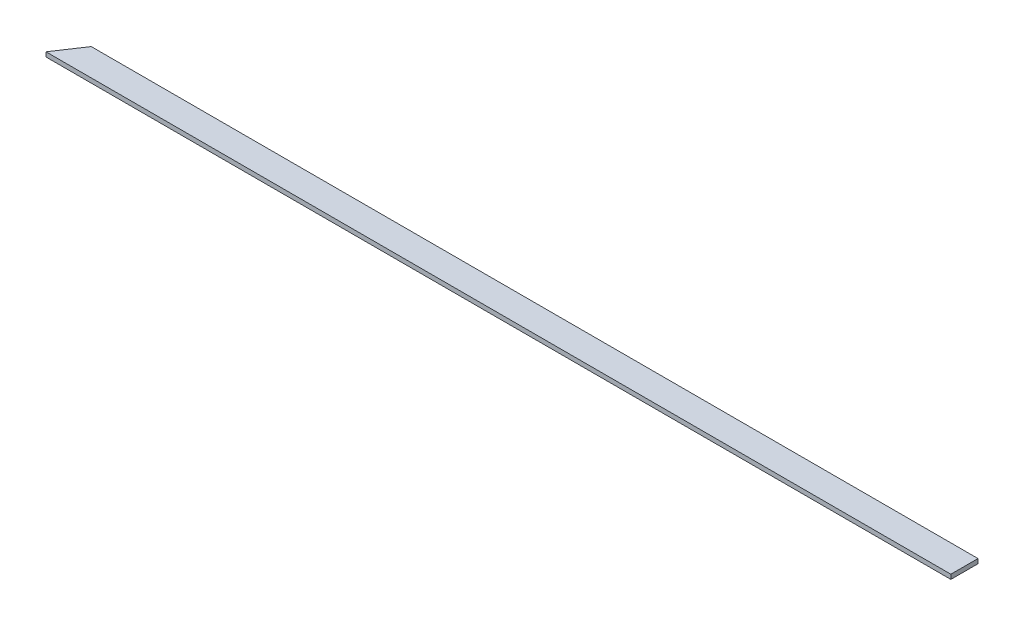
ISO-10303-21;
HEADER;
FILE_DESCRIPTION(('STEP AP214'),'2;1');
FILE_NAME('part.step','',(''),(''),'','','');
FILE_SCHEMA(('AUTOMOTIVE_DESIGN { 1 0 10303 214 1 1 1 1 }'));
ENDSEC;
DATA;
#1=APPLICATION_CONTEXT('core data for automotive mechanical design processes');
#2=APPLICATION_PROTOCOL_DEFINITION('international standard','automotive_design',2000,#1);
#3=PRODUCT_CONTEXT('',#1,'mechanical');
#4=PRODUCT('Part','Part','',(#3));
#5=PRODUCT_RELATED_PRODUCT_CATEGORY('part','',(#4));
#6=PRODUCT_DEFINITION_FORMATION('','',#4);
#7=PRODUCT_DEFINITION_CONTEXT('part definition',#1,'design');
#8=PRODUCT_DEFINITION('design','',#6,#7);
#9=PRODUCT_DEFINITION_SHAPE('','',#8);
#10=(LENGTH_UNIT() NAMED_UNIT(*) SI_UNIT(.MILLI.,.METRE.));
#11=(NAMED_UNIT(*) PLANE_ANGLE_UNIT() SI_UNIT($,.RADIAN.));
#12=(NAMED_UNIT(*) SI_UNIT($,.STERADIAN.) SOLID_ANGLE_UNIT());
#13=UNCERTAINTY_MEASURE_WITH_UNIT(LENGTH_MEASURE(1.E-05),#10,'distance_accuracy_value','');
#14=(GEOMETRIC_REPRESENTATION_CONTEXT(3) GLOBAL_UNCERTAINTY_ASSIGNED_CONTEXT((#13)) GLOBAL_UNIT_ASSIGNED_CONTEXT((#10,
#11,#12)) REPRESENTATION_CONTEXT('',''));
#15=CARTESIAN_POINT('',(0.,0.,0.));
#16=DIRECTION('',(0.,0.,1.));
#17=DIRECTION('',(1.,0.,0.));
#18=AXIS2_PLACEMENT_3D('',#15,#16,#17);
#19=CARTESIAN_POINT('',(-25.,0.125,0.));
#20=DIRECTION('',(0.832050294337845,0.,0.554700196225227));
#21=DIRECTION('',(0.554700196225227,0.,-0.832050294337845));
#22=AXIS2_PLACEMENT_3D('',#19,#20,#21);
#23=PLANE('',#22);
#24=DIRECTION('',(-0.554700196225227,0.,0.832050294337845));
#25=VECTOR('',#24,1.);
#26=CARTESIAN_POINT('',(-25.,-0.125,0.));
#27=LINE('',#26,#25);
#28=CARTESIAN_POINT('',(-24.,-0.125,-1.50000000000001));
#29=VERTEX_POINT('',#28);
#30=CARTESIAN_POINT('',(-25.,-0.125,0.));
#31=VERTEX_POINT('',#30);
#32=EDGE_CURVE('E107',#29,#31,#27,.T.);
#33=ORIENTED_EDGE('',*,*,#32,.T.);
#34=DIRECTION('',(0.,-1.,0.));
#35=VECTOR('',#34,1.);
#36=CARTESIAN_POINT('',(-25.,0.125,0.));
#37=LINE('',#36,#35);
#38=CARTESIAN_POINT('',(-25.,0.125,0.));
#39=VERTEX_POINT('',#38);
#40=EDGE_CURVE('E11',#39,#31,#37,.T.);
#41=ORIENTED_EDGE('',*,*,#40,.F.);
#42=DIRECTION('',(-0.554700196225227,0.,0.832050294337845));
#43=VECTOR('',#42,1.);
#44=CARTESIAN_POINT('',(-25.,0.125,0.));
#45=LINE('',#44,#43);
#46=CARTESIAN_POINT('',(-24.,0.125,-1.50000000000001));
#47=VERTEX_POINT('',#46);
#48=EDGE_CURVE('E91',#47,#39,#45,.T.);
#49=ORIENTED_EDGE('',*,*,#48,.F.);
#50=DIRECTION('',(0.,-1.,0.));
#51=VECTOR('',#50,1.);
#52=CARTESIAN_POINT('',(-24.,0.125,-1.50000000000001));
#53=LINE('',#52,#51);
#54=EDGE_CURVE('E103',#47,#29,#53,.T.);
#55=ORIENTED_EDGE('',*,*,#54,.T.);
#56=EDGE_LOOP('',(#33,#41,#49,#55));
#57=FACE_BOUND('',#56,.T.);
#58=ADVANCED_FACE('F39',(#57),#23,.F.);
#59=CARTESIAN_POINT('',(-25.,0.125,0.));
#60=DIRECTION('',(0.,0.,-1.));
#61=DIRECTION('',(-1.,0.,0.));
#62=AXIS2_PLACEMENT_3D('',#59,#60,#61);
#63=PLANE('',#62);
#64=DIRECTION('',(1.,0.,0.));
#65=VECTOR('',#64,1.);
#66=CARTESIAN_POINT('',(-25.,-0.125,0.));
#67=LINE('',#66,#65);
#68=CARTESIAN_POINT('',(25.,-0.125,0.));
#69=VERTEX_POINT('',#68);
#70=EDGE_CURVE('E96',#31,#69,#67,.T.);
#71=ORIENTED_EDGE('',*,*,#70,.T.);
#72=DIRECTION('',(0.,-1.,0.));
#73=VECTOR('',#72,1.);
#74=CARTESIAN_POINT('',(25.,0.125,0.));
#75=LINE('',#74,#73);
#76=CARTESIAN_POINT('',(25.,0.125,0.));
#77=VERTEX_POINT('',#76);
#78=EDGE_CURVE('E48',#77,#69,#75,.T.);
#79=ORIENTED_EDGE('',*,*,#78,.F.);
#80=DIRECTION('',(1.,0.,0.));
#81=VECTOR('',#80,1.);
#82=CARTESIAN_POINT('',(-25.,0.125,0.));
#83=LINE('',#82,#81);
#84=EDGE_CURVE('E86',#39,#77,#83,.T.);
#85=ORIENTED_EDGE('',*,*,#84,.F.);
#86=ORIENTED_EDGE('',*,*,#40,.T.);
#87=EDGE_LOOP('',(#71,#79,#85,#86));
#88=FACE_BOUND('',#87,.T.);
#89=ADVANCED_FACE('F95',(#88),#63,.F.);
#90=CARTESIAN_POINT('',(25.,0.125,-1.50000000000001));
#91=DIRECTION('',(-1.,0.,0.));
#92=DIRECTION('',(0.,0.,1.));
#93=AXIS2_PLACEMENT_3D('',#90,#91,#92);
#94=PLANE('',#93);
#95=DIRECTION('',(0.,0.,-1.));
#96=VECTOR('',#95,1.);
#97=CARTESIAN_POINT('',(25.,-0.125,-1.50000000000001));
#98=LINE('',#97,#96);
#99=CARTESIAN_POINT('',(25.,-0.125,-1.50000000000001));
#100=VERTEX_POINT('',#99);
#101=EDGE_CURVE('E73',#69,#100,#98,.T.);
#102=ORIENTED_EDGE('',*,*,#101,.T.);
#103=DIRECTION('',(0.,-1.,0.));
#104=VECTOR('',#103,1.);
#105=CARTESIAN_POINT('',(25.,0.125,-1.50000000000001));
#106=LINE('',#105,#104);
#107=CARTESIAN_POINT('',(25.,0.125,-1.50000000000001));
#108=VERTEX_POINT('',#107);
#109=EDGE_CURVE('E98',#108,#100,#106,.T.);
#110=ORIENTED_EDGE('',*,*,#109,.F.);
#111=DIRECTION('',(0.,0.,-1.));
#112=VECTOR('',#111,1.);
#113=CARTESIAN_POINT('',(25.,0.125,-1.50000000000001));
#114=LINE('',#113,#112);
#115=EDGE_CURVE('E89',#77,#108,#114,.T.);
#116=ORIENTED_EDGE('',*,*,#115,.F.);
#117=ORIENTED_EDGE('',*,*,#78,.T.);
#118=EDGE_LOOP('',(#102,#110,#116,#117));
#119=FACE_BOUND('',#118,.T.);
#120=ADVANCED_FACE('F99',(#119),#94,.F.);
#121=CARTESIAN_POINT('',(-24.,0.125,-1.50000000000001));
#122=DIRECTION('',(0.,0.,1.));
#123=DIRECTION('',(1.,0.,0.));
#124=AXIS2_PLACEMENT_3D('',#121,#122,#123);
#125=PLANE('',#124);
#126=DIRECTION('',(-1.,0.,0.));
#127=VECTOR('',#126,1.);
#128=CARTESIAN_POINT('',(-24.,-0.125,-1.50000000000001));
#129=LINE('',#128,#127);
#130=EDGE_CURVE('E79',#100,#29,#129,.T.);
#131=ORIENTED_EDGE('',*,*,#130,.T.);
#132=ORIENTED_EDGE('',*,*,#54,.F.);
#133=DIRECTION('',(-1.,0.,0.));
#134=VECTOR('',#133,1.);
#135=CARTESIAN_POINT('',(-24.,0.125,-1.50000000000001));
#136=LINE('',#135,#134);
#137=EDGE_CURVE('E56',#108,#47,#136,.T.);
#138=ORIENTED_EDGE('',*,*,#137,.F.);
#139=ORIENTED_EDGE('',*,*,#109,.T.);
#140=EDGE_LOOP('',(#131,#132,#138,#139));
#141=FACE_BOUND('',#140,.T.);
#142=ADVANCED_FACE('F120',(#141),#125,.F.);
#143=CARTESIAN_POINT('',(0.,0.125,0.));
#144=DIRECTION('',(0.,-1.,0.));
#145=DIRECTION('',(0.,0.,-1.));
#146=AXIS2_PLACEMENT_3D('',#143,#144,#145);
#147=PLANE('',#146);
#148=ORIENTED_EDGE('',*,*,#48,.T.);
#149=ORIENTED_EDGE('',*,*,#84,.T.);
#150=ORIENTED_EDGE('',*,*,#115,.T.);
#151=ORIENTED_EDGE('',*,*,#137,.T.);
#152=EDGE_LOOP('',(#148,#149,#150,#151));
#153=FACE_BOUND('',#152,.T.);
#154=ADVANCED_FACE('F87',(#153),#147,.F.);
#155=CARTESIAN_POINT('',(0.,-0.125,0.));
#156=DIRECTION('',(0.,-1.,0.));
#157=DIRECTION('',(0.,0.,-1.));
#158=AXIS2_PLACEMENT_3D('',#155,#156,#157);
#159=PLANE('',#158);
#160=ORIENTED_EDGE('',*,*,#32,.F.);
#161=ORIENTED_EDGE('',*,*,#130,.F.);
#162=ORIENTED_EDGE('',*,*,#101,.F.);
#163=ORIENTED_EDGE('',*,*,#70,.F.);
#164=EDGE_LOOP('',(#160,#161,#162,#163));
#165=FACE_BOUND('',#164,.T.);
#166=ADVANCED_FACE('F123',(#165),#159,.T.);
#167=CLOSED_SHELL('',(#58,#89,#120,#142,#154,#166));
#168=MANIFOLD_SOLID_BREP('B2',#167);
#169=ADVANCED_BREP_SHAPE_REPRESENTATION('',(#18,#168),#14);
#170=SHAPE_DEFINITION_REPRESENTATION(#9,#169);
ENDSEC;
END-ISO-10303-21;
